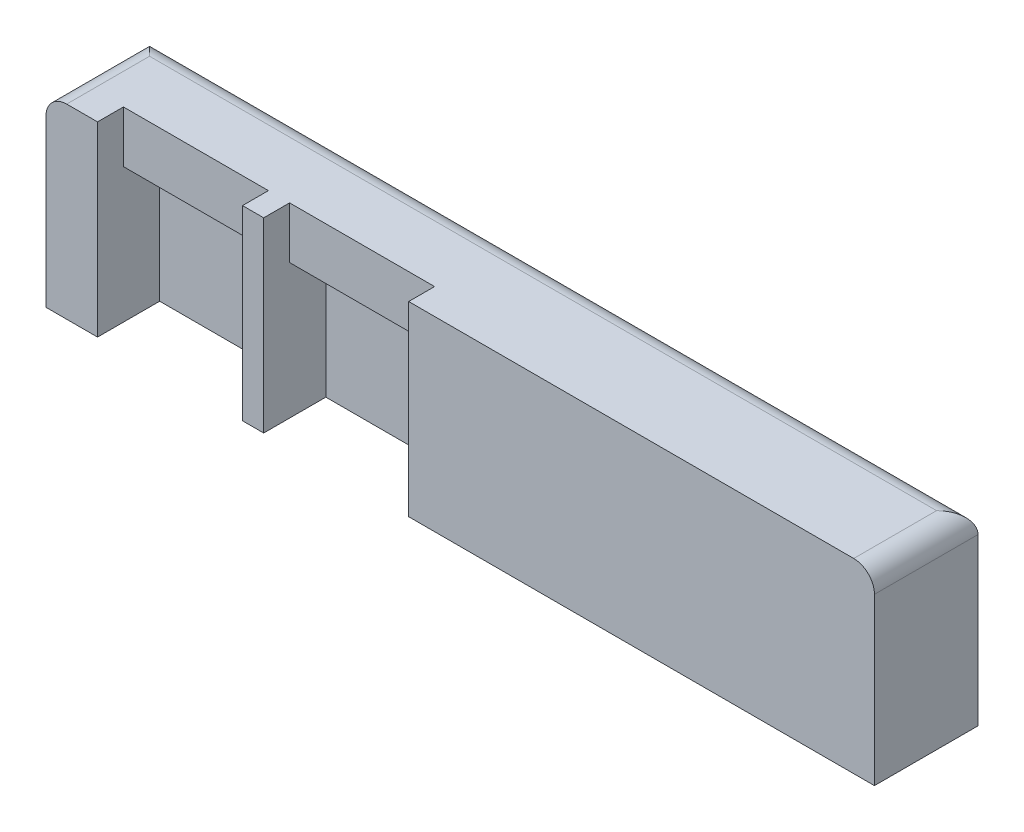
ISO-10303-21;
HEADER;
FILE_DESCRIPTION(('STEP AP214'),'2;1');
FILE_NAME('part.step','',(''),(''),'','','');
FILE_SCHEMA(('AUTOMOTIVE_DESIGN { 1 0 10303 214 1 1 1 1 }'));
ENDSEC;
DATA;
#1=APPLICATION_CONTEXT('core data for automotive mechanical design processes');
#2=APPLICATION_PROTOCOL_DEFINITION('international standard','automotive_design',2000,#1);
#3=PRODUCT_CONTEXT('',#1,'mechanical');
#4=PRODUCT('Part','Part','',(#3));
#5=PRODUCT_RELATED_PRODUCT_CATEGORY('part','',(#4));
#6=PRODUCT_DEFINITION_FORMATION('','',#4);
#7=PRODUCT_DEFINITION_CONTEXT('part definition',#1,'design');
#8=PRODUCT_DEFINITION('design','',#6,#7);
#9=PRODUCT_DEFINITION_SHAPE('','',#8);
#10=(LENGTH_UNIT() NAMED_UNIT(*) SI_UNIT(.MILLI.,.METRE.));
#11=(NAMED_UNIT(*) PLANE_ANGLE_UNIT() SI_UNIT($,.RADIAN.));
#12=(NAMED_UNIT(*) SI_UNIT($,.STERADIAN.) SOLID_ANGLE_UNIT());
#13=UNCERTAINTY_MEASURE_WITH_UNIT(LENGTH_MEASURE(1.E-05),#10,'distance_accuracy_value','');
#14=(GEOMETRIC_REPRESENTATION_CONTEXT(3) GLOBAL_UNCERTAINTY_ASSIGNED_CONTEXT((#13)) GLOBAL_UNIT_ASSIGNED_CONTEXT((#10,
#11,#12)) REPRESENTATION_CONTEXT('',''));
#15=CARTESIAN_POINT('',(0.,0.,0.));
#16=DIRECTION('',(0.,0.,1.));
#17=DIRECTION('',(1.,0.,0.));
#18=AXIS2_PLACEMENT_3D('',#15,#16,#17);
#19=CARTESIAN_POINT('',(0.,27.94,0.));
#20=DIRECTION('',(0.,1.,0.));
#21=DIRECTION('',(0.,0.,1.));
#22=AXIS2_PLACEMENT_3D('',#19,#20,#21);
#23=PLANE('',#22);
#24=DIRECTION('',(-1.,0.,0.));
#25=VECTOR('',#24,1.);
#26=CARTESIAN_POINT('',(0.,27.94,-25.4));
#27=LINE('',#26,#25);
#28=CARTESIAN_POINT('',(101.6,27.94,-25.4));
#29=VERTEX_POINT('',#28);
#30=CARTESIAN_POINT('',(0.,27.94,-25.4));
#31=VERTEX_POINT('',#30);
#32=EDGE_CURVE('E386',#29,#31,#27,.T.);
#33=ORIENTED_EDGE('',*,*,#32,.F.);
#34=DIRECTION('',(0.,0.,-1.));
#35=VECTOR('',#34,1.);
#36=CARTESIAN_POINT('',(101.6,27.94,0.));
#37=LINE('',#36,#35);
#38=CARTESIAN_POINT('',(101.6,27.94,-12.7));
#39=VERTEX_POINT('',#38);
#40=EDGE_CURVE('E389',#39,#29,#37,.T.);
#41=ORIENTED_EDGE('',*,*,#40,.F.);
#42=DIRECTION('',(-1.,0.,0.));
#43=VECTOR('',#42,1.);
#44=CARTESIAN_POINT('',(0.,27.94,-12.7));
#45=LINE('',#44,#43);
#46=CARTESIAN_POINT('',(44.478800344837,27.94,-12.7));
#47=VERTEX_POINT('',#46);
#48=EDGE_CURVE('E43',#39,#47,#45,.T.);
#49=ORIENTED_EDGE('',*,*,#48,.T.);
#50=DIRECTION('',(0.,0.,1.));
#51=VECTOR('',#50,1.);
#52=CARTESIAN_POINT('',(44.478800344837,27.94,-20.32));
#53=LINE('',#52,#51);
#54=CARTESIAN_POINT('',(44.478800344837,27.94,-20.32));
#55=VERTEX_POINT('',#54);
#56=EDGE_CURVE('E381',#55,#47,#53,.T.);
#57=ORIENTED_EDGE('',*,*,#56,.F.);
#58=DIRECTION('',(1.,0.,0.));
#59=VECTOR('',#58,1.);
#60=CARTESIAN_POINT('',(0.,27.94,-20.32));
#61=LINE('',#60,#59);
#62=CARTESIAN_POINT('',(26.698800344837,27.94,-20.32));
#63=VERTEX_POINT('',#62);
#64=EDGE_CURVE('E176',#63,#55,#61,.T.);
#65=ORIENTED_EDGE('',*,*,#64,.F.);
#66=DIRECTION('',(0.,0.,-1.));
#67=VECTOR('',#66,1.);
#68=CARTESIAN_POINT('',(26.698800344837,27.94,-20.32));
#69=LINE('',#68,#67);
#70=CARTESIAN_POINT('',(26.698800344837,27.94,-12.7));
#71=VERTEX_POINT('',#70);
#72=EDGE_CURVE('E298',#71,#63,#69,.T.);
#73=ORIENTED_EDGE('',*,*,#72,.F.);
#74=CARTESIAN_POINT('',(24.1011996551631,27.94,-12.7));
#75=VERTEX_POINT('',#74);
#76=EDGE_CURVE('E287',#71,#75,#45,.T.);
#77=ORIENTED_EDGE('',*,*,#76,.T.);
#78=DIRECTION('',(0.,0.,1.));
#79=VECTOR('',#78,1.);
#80=CARTESIAN_POINT('',(24.1011996551631,27.94,-20.32));
#81=LINE('',#80,#79);
#82=CARTESIAN_POINT('',(24.1011996551631,27.94,-20.32));
#83=VERTEX_POINT('',#82);
#84=EDGE_CURVE('E175',#83,#75,#81,.T.);
#85=ORIENTED_EDGE('',*,*,#84,.F.);
#86=DIRECTION('',(-1.,0.,0.));
#87=VECTOR('',#86,1.);
#88=CARTESIAN_POINT('',(0.,27.94,-20.32));
#89=LINE('',#88,#87);
#90=CARTESIAN_POINT('',(6.32119965516305,27.94,-20.32));
#91=VERTEX_POINT('',#90);
#92=EDGE_CURVE('E179',#83,#91,#89,.T.);
#93=ORIENTED_EDGE('',*,*,#92,.T.);
#94=DIRECTION('',(0.,0.,-1.));
#95=VECTOR('',#94,1.);
#96=CARTESIAN_POINT('',(6.32119965516305,27.94,-20.32));
#97=LINE('',#96,#95);
#98=CARTESIAN_POINT('',(6.32119965516305,27.94,-12.7));
#99=VERTEX_POINT('',#98);
#100=EDGE_CURVE('E163',#99,#91,#97,.T.);
#101=ORIENTED_EDGE('',*,*,#100,.F.);
#102=CARTESIAN_POINT('',(0.,27.94,-12.7));
#103=VERTEX_POINT('',#102);
#104=EDGE_CURVE('E301',#99,#103,#45,.T.);
#105=ORIENTED_EDGE('',*,*,#104,.T.);
#106=DIRECTION('',(0.,0.,1.));
#107=VECTOR('',#106,1.);
#108=CARTESIAN_POINT('',(0.,27.94,0.));
#109=LINE('',#108,#107);
#110=EDGE_CURVE('E260',#31,#103,#109,.T.);
#111=ORIENTED_EDGE('',*,*,#110,.F.);
#112=EDGE_LOOP('',(#33,#41,#49,#57,#65,#73,#77,#85,#93,#101,#105,#111));
#113=FACE_BOUND('',#112,.T.);
#114=ADVANCED_FACE('F39',(#113),#23,.F.);
#115=CARTESIAN_POINT('',(0.,0.,-12.7));
#116=DIRECTION('',(0.,0.,1.));
#117=DIRECTION('',(1.,0.,0.));
#118=AXIS2_PLACEMENT_3D('',#115,#116,#117);
#119=PLANE('',#118);
#120=DIRECTION('',(-1.,0.,0.));
#121=VECTOR('',#120,1.);
#122=CARTESIAN_POINT('',(0.,50.8,-12.7));
#123=LINE('',#122,#121);
#124=CARTESIAN_POINT('',(99.06,50.8,-12.7));
#125=VERTEX_POINT('',#124);
#126=CARTESIAN_POINT('',(44.4788003448369,50.8,-12.7));
#127=VERTEX_POINT('',#126);
#128=EDGE_CURVE('E265',#125,#127,#123,.T.);
#129=ORIENTED_EDGE('',*,*,#128,.T.);
#130=DIRECTION('',(0.,-1.,0.));
#131=VECTOR('',#130,1.);
#132=CARTESIAN_POINT('',(44.478800344837,6.3388444270934,-12.7));
#133=LINE('',#132,#131);
#134=EDGE_CURVE('E275',#127,#47,#133,.T.);
#135=ORIENTED_EDGE('',*,*,#134,.T.);
#136=ORIENTED_EDGE('',*,*,#48,.F.);
#137=DIRECTION('',(0.,1.,0.));
#138=VECTOR('',#137,1.);
#139=CARTESIAN_POINT('',(101.6,50.8,-12.7));
#140=LINE('',#139,#138);
#141=CARTESIAN_POINT('',(101.6,48.26,-12.7));
#142=VERTEX_POINT('',#141);
#143=EDGE_CURVE('E261',#39,#142,#140,.T.);
#144=ORIENTED_EDGE('',*,*,#143,.T.);
#145=CARTESIAN_POINT('',(99.06,48.26,-12.7));
#146=DIRECTION('',(0.,0.,1.));
#147=DIRECTION('',(1.,0.,0.));
#148=AXIS2_PLACEMENT_3D('',#145,#146,#147);
#149=CIRCLE('',#148,2.54);
#150=EDGE_CURVE('E295',#125,#142,#149,.F.);
#151=ORIENTED_EDGE('',*,*,#150,.F.);
#152=EDGE_LOOP('',(#129,#135,#136,#144,#151));
#153=FACE_BOUND('',#152,.T.);
#154=ADVANCED_FACE('F398',(#153),#119,.T.);
#155=ORIENTED_EDGE('',*,*,#104,.F.);
#156=DIRECTION('',(0.,1.,0.));
#157=VECTOR('',#156,1.);
#158=CARTESIAN_POINT('',(6.32119965516305,6.3388444270934,-12.7));
#159=LINE('',#158,#157);
#160=CARTESIAN_POINT('',(6.32119965516305,50.8,-12.7));
#161=VERTEX_POINT('',#160);
#162=EDGE_CURVE('E171',#99,#161,#159,.T.);
#163=ORIENTED_EDGE('',*,*,#162,.T.);
#164=CARTESIAN_POINT('',(2.54,50.8,-12.7));
#165=VERTEX_POINT('',#164);
#166=EDGE_CURVE('E266',#161,#165,#123,.T.);
#167=ORIENTED_EDGE('',*,*,#166,.T.);
#168=CARTESIAN_POINT('',(2.54,48.26,-12.7));
#169=DIRECTION('',(0.,0.,1.));
#170=DIRECTION('',(1.,0.,0.));
#171=AXIS2_PLACEMENT_3D('',#168,#169,#170);
#172=CIRCLE('',#171,2.54);
#173=CARTESIAN_POINT('',(0.,48.26,-12.7));
#174=VERTEX_POINT('',#173);
#175=EDGE_CURVE('E255',#174,#165,#172,.F.);
#176=ORIENTED_EDGE('',*,*,#175,.F.);
#177=DIRECTION('',(0.,-1.,0.));
#178=VECTOR('',#177,1.);
#179=CARTESIAN_POINT('',(0.,50.8,-12.7));
#180=LINE('',#179,#178);
#181=EDGE_CURVE('E256',#174,#103,#180,.T.);
#182=ORIENTED_EDGE('',*,*,#181,.T.);
#183=EDGE_LOOP('',(#155,#163,#167,#176,#182));
#184=FACE_BOUND('',#183,.T.);
#185=ADVANCED_FACE('F308',(#184),#119,.T.);
#186=ORIENTED_EDGE('',*,*,#76,.F.);
#187=DIRECTION('',(0.,1.,0.));
#188=VECTOR('',#187,1.);
#189=CARTESIAN_POINT('',(26.698800344837,6.33884442709341,-12.7));
#190=LINE('',#189,#188);
#191=CARTESIAN_POINT('',(26.698800344837,50.8,-12.7));
#192=VERTEX_POINT('',#191);
#193=EDGE_CURVE('E271',#71,#192,#190,.T.);
#194=ORIENTED_EDGE('',*,*,#193,.T.);
#195=CARTESIAN_POINT('',(24.1011996551631,50.8,-12.7));
#196=VERTEX_POINT('',#195);
#197=EDGE_CURVE('E270',#192,#196,#123,.T.);
#198=ORIENTED_EDGE('',*,*,#197,.T.);
#199=DIRECTION('',(0.,-1.,0.));
#200=VECTOR('',#199,1.);
#201=CARTESIAN_POINT('',(24.1011996551631,6.33884442709341,-12.7));
#202=LINE('',#201,#200);
#203=EDGE_CURVE('E185',#196,#75,#202,.T.);
#204=ORIENTED_EDGE('',*,*,#203,.T.);
#205=EDGE_LOOP('',(#186,#194,#198,#204));
#206=FACE_BOUND('',#205,.T.);
#207=ADVANCED_FACE('F286',(#206),#119,.T.);
#208=CARTESIAN_POINT('',(44.4788003448369,3.302,-15.875));
#209=DIRECTION('',(0.,0.,-1.));
#210=DIRECTION('',(-1.,0.,0.));
#211=AXIS2_PLACEMENT_3D('',#208,#209,#210);
#212=PLANE('',#211);
#213=DIRECTION('',(0.,1.,0.));
#214=VECTOR('',#213,1.);
#215=CARTESIAN_POINT('',(44.4788003448369,3.302,-15.875));
#216=LINE('',#215,#214);
#217=CARTESIAN_POINT('',(44.4788003448369,44.4611555729066,-15.875));
#218=VERTEX_POINT('',#217);
#219=CARTESIAN_POINT('',(44.4788003448369,50.8,-15.875));
#220=VERTEX_POINT('',#219);
#221=EDGE_CURVE('E215',#218,#220,#216,.T.);
#222=ORIENTED_EDGE('',*,*,#221,.T.);
#223=DIRECTION('',(-1.,0.,0.));
#224=VECTOR('',#223,1.);
#225=CARTESIAN_POINT('',(44.4788003448369,50.8,-15.875));
#226=LINE('',#225,#224);
#227=CARTESIAN_POINT('',(26.698800344837,50.8,-15.875));
#228=VERTEX_POINT('',#227);
#229=EDGE_CURVE('E214',#220,#228,#226,.T.);
#230=ORIENTED_EDGE('',*,*,#229,.T.);
#231=DIRECTION('',(0.,1.,0.));
#232=VECTOR('',#231,1.);
#233=CARTESIAN_POINT('',(26.698800344837,3.302,-15.875));
#234=LINE('',#233,#232);
#235=CARTESIAN_POINT('',(26.698800344837,44.4611555729066,-15.875));
#236=VERTEX_POINT('',#235);
#237=EDGE_CURVE('E57',#236,#228,#234,.T.);
#238=ORIENTED_EDGE('',*,*,#237,.F.);
#239=DIRECTION('',(-1.,0.,0.));
#240=VECTOR('',#239,1.);
#241=CARTESIAN_POINT('',(26.698800344837,44.4611555729066,-15.875));
#242=LINE('',#241,#240);
#243=EDGE_CURVE('E201',#218,#236,#242,.T.);
#244=ORIENTED_EDGE('',*,*,#243,.F.);
#245=EDGE_LOOP('',(#222,#230,#238,#244));
#246=FACE_BOUND('',#245,.T.);
#247=ADVANCED_FACE('F427',(#246),#212,.F.);
#248=CARTESIAN_POINT('',(6.32119965516305,3.302,-15.875));
#249=DIRECTION('',(0.,0.,-1.));
#250=DIRECTION('',(-1.,0.,0.));
#251=AXIS2_PLACEMENT_3D('',#248,#249,#250);
#252=PLANE('',#251);
#253=DIRECTION('',(0.,1.,0.));
#254=VECTOR('',#253,1.);
#255=CARTESIAN_POINT('',(24.1011996551631,3.302,-15.875));
#256=LINE('',#255,#254);
#257=CARTESIAN_POINT('',(24.1011996551631,44.4611555729066,-15.875));
#258=VERTEX_POINT('',#257);
#259=CARTESIAN_POINT('',(24.1011996551631,50.8,-15.875));
#260=VERTEX_POINT('',#259);
#261=EDGE_CURVE('E223',#258,#260,#256,.T.);
#262=ORIENTED_EDGE('',*,*,#261,.T.);
#263=DIRECTION('',(-1.,0.,0.));
#264=VECTOR('',#263,1.);
#265=CARTESIAN_POINT('',(6.32119965516305,50.8,-15.875));
#266=LINE('',#265,#264);
#267=CARTESIAN_POINT('',(6.32119965516305,50.8,-15.875));
#268=VERTEX_POINT('',#267);
#269=EDGE_CURVE('E222',#260,#268,#266,.T.);
#270=ORIENTED_EDGE('',*,*,#269,.T.);
#271=DIRECTION('',(0.,1.,0.));
#272=VECTOR('',#271,1.);
#273=CARTESIAN_POINT('',(6.32119965516305,3.302,-15.875));
#274=LINE('',#273,#272);
#275=CARTESIAN_POINT('',(6.32119965516305,44.4611555729066,-15.875));
#276=VERTEX_POINT('',#275);
#277=EDGE_CURVE('E210',#276,#268,#274,.T.);
#278=ORIENTED_EDGE('',*,*,#277,.F.);
#279=DIRECTION('',(-1.,0.,0.));
#280=VECTOR('',#279,1.);
#281=CARTESIAN_POINT('',(24.1011996551631,44.4611555729066,-15.875));
#282=LINE('',#281,#280);
#283=EDGE_CURVE('E205',#258,#276,#282,.T.);
#284=ORIENTED_EDGE('',*,*,#283,.F.);
#285=EDGE_LOOP('',(#262,#270,#278,#284));
#286=FACE_BOUND('',#285,.T.);
#287=ADVANCED_FACE('F360',(#286),#252,.F.);
#288=CARTESIAN_POINT('',(101.6,50.8,0.));
#289=DIRECTION('',(-1.,0.,0.));
#290=DIRECTION('',(0.,0.,1.));
#291=AXIS2_PLACEMENT_3D('',#288,#289,#290);
#292=PLANE('',#291);
#293=ORIENTED_EDGE('',*,*,#143,.F.);
#294=ORIENTED_EDGE('',*,*,#40,.T.);
#295=DIRECTION('',(0.,-1.,0.));
#296=VECTOR('',#295,1.);
#297=CARTESIAN_POINT('',(101.6,50.8,-25.4));
#298=LINE('',#297,#296);
#299=CARTESIAN_POINT('',(101.6,48.26,-25.4));
#300=VERTEX_POINT('',#299);
#301=EDGE_CURVE('E332',#300,#29,#298,.T.);
#302=ORIENTED_EDGE('',*,*,#301,.F.);
#303=DIRECTION('',(0.,0.,-1.));
#304=VECTOR('',#303,1.);
#305=CARTESIAN_POINT('',(101.6,48.26,0.));
#306=LINE('',#305,#304);
#307=EDGE_CURVE('E254',#300,#142,#306,.F.);
#308=ORIENTED_EDGE('',*,*,#307,.T.);
#309=EDGE_LOOP('',(#293,#294,#302,#308));
#310=FACE_BOUND('',#309,.T.);
#311=ADVANCED_FACE('F408',(#310),#292,.F.);
#312=CARTESIAN_POINT('',(0.,48.26,-22.86));
#313=DIRECTION('',(-1.,0.,0.));
#314=DIRECTION('',(0.,0.,1.));
#315=AXIS2_PLACEMENT_3D('',#312,#313,#314);
#316=CYLINDRICAL_SURFACE('',#315,2.54);
#317=CARTESIAN_POINT('',(99.06,48.26,-22.86));
#318=DIRECTION('',(-0.707106781186548,0.,-0.707106781186547));
#319=DIRECTION('',(0.707106781186547,0.,-0.707106781186548));
#320=AXIS2_PLACEMENT_3D('',#317,#318,#319);
#321=ELLIPSE('',#320,3.59210244842766,2.54);
#322=CARTESIAN_POINT('',(99.06,50.8,-22.86));
#323=VERTEX_POINT('',#322);
#324=EDGE_CURVE('E50',#323,#300,#321,.T.);
#325=ORIENTED_EDGE('',*,*,#324,.T.);
#326=DIRECTION('',(-1.,0.,0.));
#327=VECTOR('',#326,1.);
#328=CARTESIAN_POINT('',(0.,48.26,-25.4));
#329=LINE('',#328,#327);
#330=CARTESIAN_POINT('',(0.,48.26,-25.4));
#331=VERTEX_POINT('',#330);
#332=EDGE_CURVE('E325',#331,#300,#329,.F.);
#333=ORIENTED_EDGE('',*,*,#332,.F.);
#334=CARTESIAN_POINT('',(2.54,48.26,-22.86));
#335=DIRECTION('',(-0.707106781186547,0.,0.707106781186547));
#336=DIRECTION('',(0.707106781186547,0.,0.707106781186547));
#337=AXIS2_PLACEMENT_3D('',#334,#335,#336);
#338=ELLIPSE('',#337,3.59210244842766,2.54);
#339=CARTESIAN_POINT('',(2.54,50.8,-22.86));
#340=VERTEX_POINT('',#339);
#341=EDGE_CURVE('E11',#331,#340,#338,.F.);
#342=ORIENTED_EDGE('',*,*,#341,.T.);
#343=DIRECTION('',(-1.,0.,0.));
#344=VECTOR('',#343,1.);
#345=CARTESIAN_POINT('',(0.,50.8,-22.86));
#346=LINE('',#345,#344);
#347=EDGE_CURVE('E250',#323,#340,#346,.T.);
#348=ORIENTED_EDGE('',*,*,#347,.F.);
#349=EDGE_LOOP('',(#325,#333,#342,#348));
#350=FACE_BOUND('',#349,.T.);
#351=ADVANCED_FACE('F323',(#350),#316,.T.);
#352=CARTESIAN_POINT('',(0.,50.8,0.));
#353=DIRECTION('',(0.,-1.,0.));
#354=DIRECTION('',(0.,0.,-1.));
#355=AXIS2_PLACEMENT_3D('',#352,#353,#354);
#356=PLANE('',#355);
#357=ORIENTED_EDGE('',*,*,#128,.F.);
#358=DIRECTION('',(0.,0.,-1.));
#359=VECTOR('',#358,1.);
#360=CARTESIAN_POINT('',(99.06,50.8,0.));
#361=LINE('',#360,#359);
#362=EDGE_CURVE('E246',#125,#323,#361,.T.);
#363=ORIENTED_EDGE('',*,*,#362,.T.);
#364=ORIENTED_EDGE('',*,*,#347,.T.);
#365=DIRECTION('',(0.,0.,1.));
#366=VECTOR('',#365,1.);
#367=CARTESIAN_POINT('',(2.54,50.8,0.));
#368=LINE('',#367,#366);
#369=EDGE_CURVE('E249',#340,#165,#368,.T.);
#370=ORIENTED_EDGE('',*,*,#369,.T.);
#371=ORIENTED_EDGE('',*,*,#166,.F.);
#372=DIRECTION('',(0.,0.,1.));
#373=VECTOR('',#372,1.);
#374=CARTESIAN_POINT('',(6.32119965516305,50.8,-9.525));
#375=LINE('',#374,#373);
#376=EDGE_CURVE('E219',#268,#161,#375,.T.);
#377=ORIENTED_EDGE('',*,*,#376,.F.);
#378=ORIENTED_EDGE('',*,*,#269,.F.);
#379=DIRECTION('',(0.,0.,-1.));
#380=VECTOR('',#379,1.);
#381=CARTESIAN_POINT('',(24.1011996551631,50.8,-9.525));
#382=LINE('',#381,#380);
#383=EDGE_CURVE('E227',#196,#260,#382,.T.);
#384=ORIENTED_EDGE('',*,*,#383,.F.);
#385=ORIENTED_EDGE('',*,*,#197,.F.);
#386=DIRECTION('',(0.,0.,1.));
#387=VECTOR('',#386,1.);
#388=CARTESIAN_POINT('',(26.698800344837,50.8,-9.525));
#389=LINE('',#388,#387);
#390=EDGE_CURVE('E211',#228,#192,#389,.T.);
#391=ORIENTED_EDGE('',*,*,#390,.F.);
#392=ORIENTED_EDGE('',*,*,#229,.F.);
#393=DIRECTION('',(0.,0.,-1.));
#394=VECTOR('',#393,1.);
#395=CARTESIAN_POINT('',(44.4788003448369,50.8,-9.52500000000001));
#396=LINE('',#395,#394);
#397=EDGE_CURVE('E218',#127,#220,#396,.T.);
#398=ORIENTED_EDGE('',*,*,#397,.F.);
#399=EDGE_LOOP('',(#357,#363,#364,#370,#371,#377,#378,#384,#385,#391,#392,#398));
#400=FACE_BOUND('',#399,.T.);
#401=ADVANCED_FACE('F366',(#400),#356,.F.);
#402=CARTESIAN_POINT('',(0.,50.8,0.));
#403=DIRECTION('',(1.,0.,0.));
#404=DIRECTION('',(0.,0.,-1.));
#405=AXIS2_PLACEMENT_3D('',#402,#403,#404);
#406=PLANE('',#405);
#407=ORIENTED_EDGE('',*,*,#181,.F.);
#408=DIRECTION('',(0.,0.,1.));
#409=VECTOR('',#408,1.);
#410=CARTESIAN_POINT('',(0.,48.26,0.));
#411=LINE('',#410,#409);
#412=EDGE_CURVE('E251',#174,#331,#411,.F.);
#413=ORIENTED_EDGE('',*,*,#412,.T.);
#414=DIRECTION('',(0.,-1.,0.));
#415=VECTOR('',#414,1.);
#416=CARTESIAN_POINT('',(0.,50.8,-25.4));
#417=LINE('',#416,#415);
#418=EDGE_CURVE('E336',#331,#31,#417,.T.);
#419=ORIENTED_EDGE('',*,*,#418,.T.);
#420=ORIENTED_EDGE('',*,*,#110,.T.);
#421=EDGE_LOOP('',(#407,#413,#419,#420));
#422=FACE_BOUND('',#421,.T.);
#423=ADVANCED_FACE('F311',(#422),#406,.F.);
#424=CARTESIAN_POINT('',(2.54,48.26,0.));
#425=DIRECTION('',(0.,0.,1.));
#426=DIRECTION('',(1.,0.,0.));
#427=AXIS2_PLACEMENT_3D('',#424,#425,#426);
#428=CYLINDRICAL_SURFACE('',#427,2.54);
#429=ORIENTED_EDGE('',*,*,#412,.F.);
#430=ORIENTED_EDGE('',*,*,#175,.T.);
#431=ORIENTED_EDGE('',*,*,#369,.F.);
#432=ORIENTED_EDGE('',*,*,#341,.F.);
#433=EDGE_LOOP('',(#429,#430,#431,#432));
#434=FACE_BOUND('',#433,.T.);
#435=ADVANCED_FACE('F316',(#434),#428,.T.);
#436=CARTESIAN_POINT('',(99.06,48.26,0.));
#437=DIRECTION('',(0.,0.,-1.));
#438=DIRECTION('',(-1.,0.,0.));
#439=AXIS2_PLACEMENT_3D('',#436,#437,#438);
#440=CYLINDRICAL_SURFACE('',#439,2.54);
#441=ORIENTED_EDGE('',*,*,#362,.F.);
#442=ORIENTED_EDGE('',*,*,#150,.T.);
#443=ORIENTED_EDGE('',*,*,#307,.F.);
#444=ORIENTED_EDGE('',*,*,#324,.F.);
#445=EDGE_LOOP('',(#441,#442,#443,#444));
#446=FACE_BOUND('',#445,.T.);
#447=ADVANCED_FACE('F410',(#446),#440,.T.);
#448=CARTESIAN_POINT('',(6.32119965516305,6.3388444270934,-20.32));
#449=DIRECTION('',(-1.,0.,0.));
#450=DIRECTION('',(0.,-1.,0.));
#451=AXIS2_PLACEMENT_3D('',#448,#449,#450);
#452=PLANE('',#451);
#453=ORIENTED_EDGE('',*,*,#162,.F.);
#454=ORIENTED_EDGE('',*,*,#100,.T.);
#455=DIRECTION('',(0.,-1.,0.));
#456=VECTOR('',#455,1.);
#457=CARTESIAN_POINT('',(6.32119965516305,6.3388444270934,-20.32));
#458=LINE('',#457,#456);
#459=CARTESIAN_POINT('',(6.32119965516305,44.4611555729066,-20.32));
#460=VERTEX_POINT('',#459);
#461=EDGE_CURVE('E168',#460,#91,#458,.T.);
#462=ORIENTED_EDGE('',*,*,#461,.F.);
#463=DIRECTION('',(0.,0.,1.));
#464=VECTOR('',#463,1.);
#465=CARTESIAN_POINT('',(6.32119965516305,44.4611555729066,-20.32));
#466=LINE('',#465,#464);
#467=EDGE_CURVE('E343',#460,#276,#466,.T.);
#468=ORIENTED_EDGE('',*,*,#467,.T.);
#469=ORIENTED_EDGE('',*,*,#277,.T.);
#470=ORIENTED_EDGE('',*,*,#376,.T.);
#471=EDGE_LOOP('',(#453,#454,#462,#468,#469,#470));
#472=FACE_BOUND('',#471,.T.);
#473=ADVANCED_FACE('F165',(#472),#452,.F.);
#474=CARTESIAN_POINT('',(24.1011996551631,44.4611555729066,-20.32));
#475=DIRECTION('',(0.,1.,0.));
#476=DIRECTION('',(0.,0.,1.));
#477=AXIS2_PLACEMENT_3D('',#474,#475,#476);
#478=PLANE('',#477);
#479=DIRECTION('',(0.,0.,1.));
#480=VECTOR('',#479,1.);
#481=CARTESIAN_POINT('',(24.1011996551631,44.4611555729066,-20.32));
#482=LINE('',#481,#480);
#483=CARTESIAN_POINT('',(24.1011996551631,44.4611555729066,-20.32));
#484=VERTEX_POINT('',#483);
#485=EDGE_CURVE('E353',#484,#258,#482,.T.);
#486=ORIENTED_EDGE('',*,*,#485,.T.);
#487=ORIENTED_EDGE('',*,*,#283,.T.);
#488=ORIENTED_EDGE('',*,*,#467,.F.);
#489=DIRECTION('',(-1.,0.,0.));
#490=VECTOR('',#489,1.);
#491=CARTESIAN_POINT('',(24.1011996551631,44.4611555729066,-20.32));
#492=LINE('',#491,#490);
#493=EDGE_CURVE('E188',#484,#460,#492,.T.);
#494=ORIENTED_EDGE('',*,*,#493,.F.);
#495=EDGE_LOOP('',(#486,#487,#488,#494));
#496=FACE_BOUND('',#495,.T.);
#497=ADVANCED_FACE('F358',(#496),#478,.F.);
#498=CARTESIAN_POINT('',(24.1011996551631,6.33884442709341,-20.32));
#499=DIRECTION('',(1.,0.,0.));
#500=DIRECTION('',(0.,0.,-1.));
#501=AXIS2_PLACEMENT_3D('',#498,#499,#500);
#502=PLANE('',#501);
#503=ORIENTED_EDGE('',*,*,#203,.F.);
#504=ORIENTED_EDGE('',*,*,#383,.T.);
#505=ORIENTED_EDGE('',*,*,#261,.F.);
#506=ORIENTED_EDGE('',*,*,#485,.F.);
#507=DIRECTION('',(0.,1.,0.));
#508=VECTOR('',#507,1.);
#509=CARTESIAN_POINT('',(24.1011996551631,6.33884442709341,-20.32));
#510=LINE('',#509,#508);
#511=EDGE_CURVE('E191',#83,#484,#510,.T.);
#512=ORIENTED_EDGE('',*,*,#511,.F.);
#513=ORIENTED_EDGE('',*,*,#84,.T.);
#514=EDGE_LOOP('',(#503,#504,#505,#506,#512,#513));
#515=FACE_BOUND('',#514,.T.);
#516=ADVANCED_FACE('F291',(#515),#502,.F.);
#517=CARTESIAN_POINT('',(0.,0.,-20.32));
#518=DIRECTION('',(0.,0.,1.));
#519=DIRECTION('',(1.,0.,0.));
#520=AXIS2_PLACEMENT_3D('',#517,#518,#519);
#521=PLANE('',#520);
#522=ORIENTED_EDGE('',*,*,#92,.F.);
#523=ORIENTED_EDGE('',*,*,#511,.T.);
#524=ORIENTED_EDGE('',*,*,#493,.T.);
#525=ORIENTED_EDGE('',*,*,#461,.T.);
#526=EDGE_LOOP('',(#522,#523,#524,#525));
#527=FACE_BOUND('',#526,.T.);
#528=ADVANCED_FACE('F186',(#527),#521,.T.);
#529=CARTESIAN_POINT('',(26.698800344837,44.4611555729066,-20.32));
#530=DIRECTION('',(0.,1.,0.));
#531=DIRECTION('',(0.,0.,1.));
#532=AXIS2_PLACEMENT_3D('',#529,#530,#531);
#533=PLANE('',#532);
#534=DIRECTION('',(0.,0.,1.));
#535=VECTOR('',#534,1.);
#536=CARTESIAN_POINT('',(44.478800344837,44.4611555729066,-20.32));
#537=LINE('',#536,#535);
#538=CARTESIAN_POINT('',(44.478800344837,44.4611555729066,-20.32));
#539=VERTEX_POINT('',#538);
#540=EDGE_CURVE('E195',#539,#218,#537,.T.);
#541=ORIENTED_EDGE('',*,*,#540,.T.);
#542=ORIENTED_EDGE('',*,*,#243,.T.);
#543=DIRECTION('',(0.,0.,1.));
#544=VECTOR('',#543,1.);
#545=CARTESIAN_POINT('',(26.698800344837,44.4611555729066,-20.32));
#546=LINE('',#545,#544);
#547=CARTESIAN_POINT('',(26.698800344837,44.4611555729066,-20.32));
#548=VERTEX_POINT('',#547);
#549=EDGE_CURVE('E190',#548,#236,#546,.T.);
#550=ORIENTED_EDGE('',*,*,#549,.F.);
#551=DIRECTION('',(-1.,0.,0.));
#552=VECTOR('',#551,1.);
#553=CARTESIAN_POINT('',(26.698800344837,44.4611555729066,-20.32));
#554=LINE('',#553,#552);
#555=EDGE_CURVE('E244',#539,#548,#554,.T.);
#556=ORIENTED_EDGE('',*,*,#555,.F.);
#557=EDGE_LOOP('',(#541,#542,#550,#556));
#558=FACE_BOUND('',#557,.T.);
#559=ADVANCED_FACE('F487',(#558),#533,.F.);
#560=CARTESIAN_POINT('',(44.478800344837,6.3388444270934,-20.32));
#561=DIRECTION('',(1.,0.,0.));
#562=DIRECTION('',(0.,1.,0.));
#563=AXIS2_PLACEMENT_3D('',#560,#561,#562);
#564=PLANE('',#563);
#565=ORIENTED_EDGE('',*,*,#134,.F.);
#566=ORIENTED_EDGE('',*,*,#397,.T.);
#567=ORIENTED_EDGE('',*,*,#221,.F.);
#568=ORIENTED_EDGE('',*,*,#540,.F.);
#569=DIRECTION('',(0.,1.,0.));
#570=VECTOR('',#569,1.);
#571=CARTESIAN_POINT('',(44.478800344837,6.3388444270934,-20.32));
#572=LINE('',#571,#570);
#573=EDGE_CURVE('E242',#55,#539,#572,.T.);
#574=ORIENTED_EDGE('',*,*,#573,.F.);
#575=ORIENTED_EDGE('',*,*,#56,.T.);
#576=EDGE_LOOP('',(#565,#566,#567,#568,#574,#575));
#577=FACE_BOUND('',#576,.T.);
#578=ADVANCED_FACE('F400',(#577),#564,.F.);
#579=CARTESIAN_POINT('',(26.698800344837,6.33884442709341,-20.32));
#580=DIRECTION('',(-1.,0.,0.));
#581=DIRECTION('',(0.,0.,1.));
#582=AXIS2_PLACEMENT_3D('',#579,#580,#581);
#583=PLANE('',#582);
#584=ORIENTED_EDGE('',*,*,#193,.F.);
#585=ORIENTED_EDGE('',*,*,#72,.T.);
#586=DIRECTION('',(0.,-1.,0.));
#587=VECTOR('',#586,1.);
#588=CARTESIAN_POINT('',(26.698800344837,6.33884442709341,-20.32));
#589=LINE('',#588,#587);
#590=EDGE_CURVE('E206',#548,#63,#589,.T.);
#591=ORIENTED_EDGE('',*,*,#590,.F.);
#592=ORIENTED_EDGE('',*,*,#549,.T.);
#593=ORIENTED_EDGE('',*,*,#237,.T.);
#594=ORIENTED_EDGE('',*,*,#390,.T.);
#595=EDGE_LOOP('',(#584,#585,#591,#592,#593,#594));
#596=FACE_BOUND('',#595,.T.);
#597=ADVANCED_FACE('F41',(#596),#583,.F.);
#598=CARTESIAN_POINT('',(0.,0.,-20.32));
#599=DIRECTION('',(0.,0.,-1.));
#600=DIRECTION('',(-1.,0.,0.));
#601=AXIS2_PLACEMENT_3D('',#598,#599,#600);
#602=PLANE('',#601);
#603=ORIENTED_EDGE('',*,*,#590,.T.);
#604=ORIENTED_EDGE('',*,*,#64,.T.);
#605=ORIENTED_EDGE('',*,*,#573,.T.);
#606=ORIENTED_EDGE('',*,*,#555,.T.);
#607=EDGE_LOOP('',(#603,#604,#605,#606));
#608=FACE_BOUND('',#607,.T.);
#609=ADVANCED_FACE('F514',(#608),#602,.F.);
#610=CARTESIAN_POINT('',(0.,50.8,-25.4));
#611=DIRECTION('',(0.,0.,1.));
#612=DIRECTION('',(1.,0.,0.));
#613=AXIS2_PLACEMENT_3D('',#610,#611,#612);
#614=PLANE('',#613);
#615=ORIENTED_EDGE('',*,*,#301,.T.);
#616=ORIENTED_EDGE('',*,*,#32,.T.);
#617=ORIENTED_EDGE('',*,*,#418,.F.);
#618=ORIENTED_EDGE('',*,*,#332,.T.);
#619=EDGE_LOOP('',(#615,#616,#617,#618));
#620=FACE_BOUND('',#619,.T.);
#621=ADVANCED_FACE('F434',(#620),#614,.F.);
#622=CLOSED_SHELL('',(#114,#154,#185,#207,#247,#287,#311,#351,#401,#423,#435,#447,#473,#497,
#516,#528,#559,#578,#597,#609,#621));
#623=MANIFOLD_SOLID_BREP('B2',#622);
#624=ADVANCED_BREP_SHAPE_REPRESENTATION('',(#18,#623),#14);
#625=SHAPE_DEFINITION_REPRESENTATION(#9,#624);
ENDSEC;
END-ISO-10303-21;
